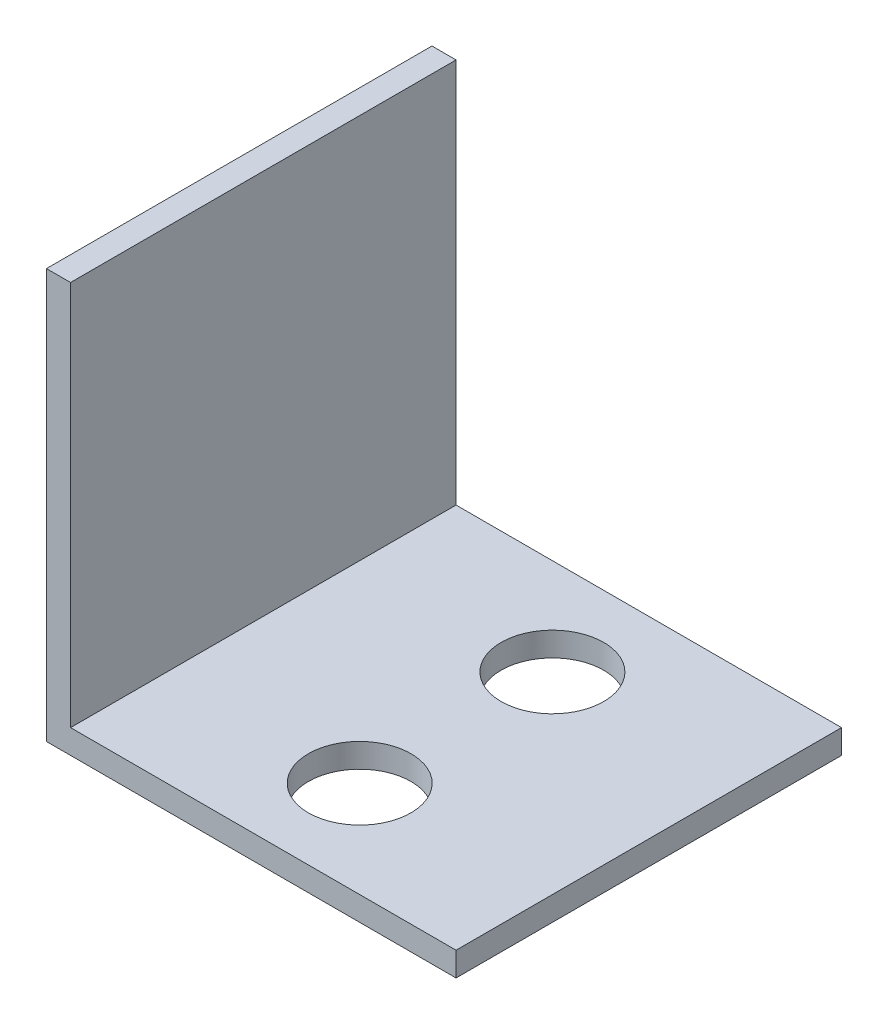
ISO-10303-21;
HEADER;
FILE_DESCRIPTION(('STEP AP214'),'2;1');
FILE_NAME('part.step','',(''),(''),'','','');
FILE_SCHEMA(('AUTOMOTIVE_DESIGN { 1 0 10303 214 1 1 1 1 }'));
ENDSEC;
DATA;
#1=APPLICATION_CONTEXT('core data for automotive mechanical design processes');
#2=APPLICATION_PROTOCOL_DEFINITION('international standard','automotive_design',2000,#1);
#3=PRODUCT_CONTEXT('',#1,'mechanical');
#4=PRODUCT('Part','Part','',(#3));
#5=PRODUCT_RELATED_PRODUCT_CATEGORY('part','',(#4));
#6=PRODUCT_DEFINITION_FORMATION('','',#4);
#7=PRODUCT_DEFINITION_CONTEXT('part definition',#1,'design');
#8=PRODUCT_DEFINITION('design','',#6,#7);
#9=PRODUCT_DEFINITION_SHAPE('','',#8);
#10=(LENGTH_UNIT() NAMED_UNIT(*) SI_UNIT(.MILLI.,.METRE.));
#11=(NAMED_UNIT(*) PLANE_ANGLE_UNIT() SI_UNIT($,.RADIAN.));
#12=(NAMED_UNIT(*) SI_UNIT($,.STERADIAN.) SOLID_ANGLE_UNIT());
#13=UNCERTAINTY_MEASURE_WITH_UNIT(LENGTH_MEASURE(1.E-05),#10,'distance_accuracy_value','');
#14=(GEOMETRIC_REPRESENTATION_CONTEXT(3) GLOBAL_UNCERTAINTY_ASSIGNED_CONTEXT((#13)) GLOBAL_UNIT_ASSIGNED_CONTEXT((#10,
#11,#12)) REPRESENTATION_CONTEXT('',''));
#15=CARTESIAN_POINT('',(0.,0.,0.));
#16=DIRECTION('',(0.,0.,1.));
#17=DIRECTION('',(1.,0.,0.));
#18=AXIS2_PLACEMENT_3D('',#15,#16,#17);
#19=CARTESIAN_POINT('',(25.4,0.,25.4));
#20=DIRECTION('',(0.,-1.,0.));
#21=DIRECTION('',(1.,0.,0.));
#22=AXIS2_PLACEMENT_3D('',#19,#20,#21);
#23=PLANE('',#22);
#24=DIRECTION('',(-1.,0.,0.));
#25=VECTOR('',#24,1.);
#26=CARTESIAN_POINT('',(25.4,0.,0.));
#27=LINE('',#26,#25);
#28=CARTESIAN_POINT('',(25.4,0.,0.));
#29=VERTEX_POINT('',#28);
#30=CARTESIAN_POINT('',(0.,0.,0.));
#31=VERTEX_POINT('',#30);
#32=EDGE_CURVE('E116',#29,#31,#27,.T.);
#33=ORIENTED_EDGE('',*,*,#32,.T.);
#34=DIRECTION('',(0.,0.,-1.));
#35=VECTOR('',#34,1.);
#36=CARTESIAN_POINT('',(0.,0.,25.4));
#37=LINE('',#36,#35);
#38=CARTESIAN_POINT('',(0.,0.,25.4));
#39=VERTEX_POINT('',#38);
#40=EDGE_CURVE('E11',#39,#31,#37,.T.);
#41=ORIENTED_EDGE('',*,*,#40,.F.);
#42=DIRECTION('',(-1.,0.,0.));
#43=VECTOR('',#42,1.);
#44=CARTESIAN_POINT('',(25.4,0.,25.4));
#45=LINE('',#44,#43);
#46=CARTESIAN_POINT('',(25.4,0.,25.4));
#47=VERTEX_POINT('',#46);
#48=EDGE_CURVE('E127',#47,#39,#45,.T.);
#49=ORIENTED_EDGE('',*,*,#48,.F.);
#50=DIRECTION('',(0.,0.,-1.));
#51=VECTOR('',#50,1.);
#52=CARTESIAN_POINT('',(25.4,0.,25.4));
#53=LINE('',#52,#51);
#54=EDGE_CURVE('E112',#47,#29,#53,.T.);
#55=ORIENTED_EDGE('',*,*,#54,.T.);
#56=EDGE_LOOP('',(#33,#41,#49,#55));
#57=FACE_BOUND('',#56,.T.);
#58=CARTESIAN_POINT('',(12.7,0.,6.35));
#59=DIRECTION('',(0.,1.,0.));
#60=DIRECTION('',(0.,0.,1.));
#61=AXIS2_PLACEMENT_3D('',#58,#59,#60);
#62=CIRCLE('',#61,3.37819999999999);
#63=CARTESIAN_POINT('',(12.7,0.,9.72819999999999));
#64=VERTEX_POINT('',#63);
#65=EDGE_CURVE('E225',#64,#64,#62,.T.);
#66=ORIENTED_EDGE('',*,*,#65,.F.);
#67=EDGE_LOOP('',(#66));
#68=FACE_BOUND('',#67,.T.);
#69=CARTESIAN_POINT('',(12.7,0.,19.05));
#70=DIRECTION('',(0.,1.,0.));
#71=DIRECTION('',(0.,0.,1.));
#72=AXIS2_PLACEMENT_3D('',#69,#70,#71);
#73=CIRCLE('',#72,3.37819999999999);
#74=CARTESIAN_POINT('',(12.7,0.,22.4282));
#75=VERTEX_POINT('',#74);
#76=EDGE_CURVE('E222',#75,#75,#73,.T.);
#77=ORIENTED_EDGE('',*,*,#76,.F.);
#78=EDGE_LOOP('',(#77));
#79=FACE_BOUND('',#78,.T.);
#80=ADVANCED_FACE('F32',(#57,#68,#79),#23,.F.);
#81=CARTESIAN_POINT('',(0.,0.,25.4));
#82=DIRECTION('',(-1.,0.,0.));
#83=DIRECTION('',(0.,0.,1.));
#84=AXIS2_PLACEMENT_3D('',#81,#82,#83);
#85=PLANE('',#84);
#86=DIRECTION('',(0.,1.,0.));
#87=VECTOR('',#86,1.);
#88=CARTESIAN_POINT('',(0.,0.,0.));
#89=LINE('',#88,#87);
#90=CARTESIAN_POINT('',(0.,25.4,0.));
#91=VERTEX_POINT('',#90);
#92=EDGE_CURVE('E119',#31,#91,#89,.T.);
#93=ORIENTED_EDGE('',*,*,#92,.T.);
#94=DIRECTION('',(0.,0.,-1.));
#95=VECTOR('',#94,1.);
#96=CARTESIAN_POINT('',(0.,25.4,25.4));
#97=LINE('',#96,#95);
#98=CARTESIAN_POINT('',(0.,25.4,25.4));
#99=VERTEX_POINT('',#98);
#100=EDGE_CURVE('E40',#99,#91,#97,.T.);
#101=ORIENTED_EDGE('',*,*,#100,.F.);
#102=DIRECTION('',(0.,1.,0.));
#103=VECTOR('',#102,1.);
#104=CARTESIAN_POINT('',(0.,0.,25.4));
#105=LINE('',#104,#103);
#106=EDGE_CURVE('E85',#39,#99,#105,.T.);
#107=ORIENTED_EDGE('',*,*,#106,.F.);
#108=ORIENTED_EDGE('',*,*,#40,.T.);
#109=EDGE_LOOP('',(#93,#101,#107,#108));
#110=FACE_BOUND('',#109,.T.);
#111=ADVANCED_FACE('F153',(#110),#85,.F.);
#112=CARTESIAN_POINT('',(0.,25.4,25.4));
#113=DIRECTION('',(0.,-1.,0.));
#114=DIRECTION('',(0.,0.,-1.));
#115=AXIS2_PLACEMENT_3D('',#112,#113,#114);
#116=PLANE('',#115);
#117=DIRECTION('',(-1.,0.,0.));
#118=VECTOR('',#117,1.);
#119=CARTESIAN_POINT('',(0.,25.4,0.));
#120=LINE('',#119,#118);
#121=CARTESIAN_POINT('',(-1.5875,25.4,0.));
#122=VERTEX_POINT('',#121);
#123=EDGE_CURVE('E122',#91,#122,#120,.T.);
#124=ORIENTED_EDGE('',*,*,#123,.T.);
#125=DIRECTION('',(0.,0.,-1.));
#126=VECTOR('',#125,1.);
#127=CARTESIAN_POINT('',(-1.5875,25.4,25.4));
#128=LINE('',#127,#126);
#129=CARTESIAN_POINT('',(-1.5875,25.4,25.4));
#130=VERTEX_POINT('',#129);
#131=EDGE_CURVE('E107',#130,#122,#128,.T.);
#132=ORIENTED_EDGE('',*,*,#131,.F.);
#133=DIRECTION('',(-1.,0.,0.));
#134=VECTOR('',#133,1.);
#135=CARTESIAN_POINT('',(0.,25.4,25.4));
#136=LINE('',#135,#134);
#137=EDGE_CURVE('E98',#99,#130,#136,.T.);
#138=ORIENTED_EDGE('',*,*,#137,.F.);
#139=ORIENTED_EDGE('',*,*,#100,.T.);
#140=EDGE_LOOP('',(#124,#132,#138,#139));
#141=FACE_BOUND('',#140,.T.);
#142=ADVANCED_FACE('F133',(#141),#116,.F.);
#143=CARTESIAN_POINT('',(-1.5875,25.4,25.4));
#144=DIRECTION('',(1.,0.,0.));
#145=DIRECTION('',(0.,1.,0.));
#146=AXIS2_PLACEMENT_3D('',#143,#144,#145);
#147=PLANE('',#146);
#148=DIRECTION('',(0.,-1.,0.));
#149=VECTOR('',#148,1.);
#150=CARTESIAN_POINT('',(-1.5875,25.4,0.));
#151=LINE('',#150,#149);
#152=CARTESIAN_POINT('',(-1.58749999999999,-1.5875,0.));
#153=VERTEX_POINT('',#152);
#154=EDGE_CURVE('E106',#122,#153,#151,.T.);
#155=ORIENTED_EDGE('',*,*,#154,.T.);
#156=DIRECTION('',(0.,0.,-1.));
#157=VECTOR('',#156,1.);
#158=CARTESIAN_POINT('',(-1.58749999999999,-1.5875,25.4));
#159=LINE('',#158,#157);
#160=CARTESIAN_POINT('',(-1.58749999999999,-1.5875,25.4));
#161=VERTEX_POINT('',#160);
#162=EDGE_CURVE('E103',#161,#153,#159,.T.);
#163=ORIENTED_EDGE('',*,*,#162,.F.);
#164=DIRECTION('',(0.,-1.,0.));
#165=VECTOR('',#164,1.);
#166=CARTESIAN_POINT('',(-1.5875,25.4,25.4));
#167=LINE('',#166,#165);
#168=EDGE_CURVE('E92',#130,#161,#167,.T.);
#169=ORIENTED_EDGE('',*,*,#168,.F.);
#170=ORIENTED_EDGE('',*,*,#131,.T.);
#171=EDGE_LOOP('',(#155,#163,#169,#170));
#172=FACE_BOUND('',#171,.T.);
#173=ADVANCED_FACE('F104',(#172),#147,.F.);
#174=CARTESIAN_POINT('',(-1.58749999999999,-1.5875,25.4));
#175=DIRECTION('',(0.,1.,0.));
#176=DIRECTION('',(-1.,0.,0.));
#177=AXIS2_PLACEMENT_3D('',#174,#175,#176);
#178=PLANE('',#177);
#179=CARTESIAN_POINT('',(12.7,-1.5875,19.05));
#180=DIRECTION('',(0.,1.,0.));
#181=DIRECTION('',(-1.,0.,0.));
#182=AXIS2_PLACEMENT_3D('',#179,#180,#181);
#183=CIRCLE('',#182,3.37819999999999);
#184=CARTESIAN_POINT('',(9.3218,-1.5875,19.05));
#185=VERTEX_POINT('',#184);
#186=EDGE_CURVE('E219',#185,#185,#183,.T.);
#187=ORIENTED_EDGE('',*,*,#186,.T.);
#188=EDGE_LOOP('',(#187));
#189=FACE_BOUND('',#188,.T.);
#190=CARTESIAN_POINT('',(12.7,-1.5875,6.35));
#191=DIRECTION('',(0.,1.,0.));
#192=DIRECTION('',(-1.,0.,0.));
#193=AXIS2_PLACEMENT_3D('',#190,#191,#192);
#194=CIRCLE('',#193,3.37819999999999);
#195=CARTESIAN_POINT('',(9.3218,-1.5875,6.35));
#196=VERTEX_POINT('',#195);
#197=EDGE_CURVE('E120',#196,#196,#194,.T.);
#198=ORIENTED_EDGE('',*,*,#197,.T.);
#199=EDGE_LOOP('',(#198));
#200=FACE_BOUND('',#199,.T.);
#201=DIRECTION('',(1.,0.,0.));
#202=VECTOR('',#201,1.);
#203=CARTESIAN_POINT('',(-1.58749999999999,-1.5875,0.));
#204=LINE('',#203,#202);
#205=CARTESIAN_POINT('',(25.4,-1.5875,0.));
#206=VERTEX_POINT('',#205);
#207=EDGE_CURVE('E71',#153,#206,#204,.T.);
#208=ORIENTED_EDGE('',*,*,#207,.T.);
#209=DIRECTION('',(0.,0.,-1.));
#210=VECTOR('',#209,1.);
#211=CARTESIAN_POINT('',(25.4,-1.5875,25.4));
#212=LINE('',#211,#210);
#213=CARTESIAN_POINT('',(25.4,-1.5875,25.4));
#214=VERTEX_POINT('',#213);
#215=EDGE_CURVE('E108',#214,#206,#212,.T.);
#216=ORIENTED_EDGE('',*,*,#215,.F.);
#217=DIRECTION('',(1.,0.,0.));
#218=VECTOR('',#217,1.);
#219=CARTESIAN_POINT('',(-1.58749999999999,-1.5875,25.4));
#220=LINE('',#219,#218);
#221=EDGE_CURVE('E96',#161,#214,#220,.T.);
#222=ORIENTED_EDGE('',*,*,#221,.F.);
#223=ORIENTED_EDGE('',*,*,#162,.T.);
#224=EDGE_LOOP('',(#208,#216,#222,#223));
#225=FACE_BOUND('',#224,.T.);
#226=ADVANCED_FACE('F110',(#189,#200,#225),#178,.F.);
#227=CARTESIAN_POINT('',(25.4,-1.5875,25.4));
#228=DIRECTION('',(-1.,0.,0.));
#229=DIRECTION('',(0.,0.,1.));
#230=AXIS2_PLACEMENT_3D('',#227,#228,#229);
#231=PLANE('',#230);
#232=DIRECTION('',(0.,1.,0.));
#233=VECTOR('',#232,1.);
#234=CARTESIAN_POINT('',(25.4,-1.5875,0.));
#235=LINE('',#234,#233);
#236=EDGE_CURVE('E77',#206,#29,#235,.T.);
#237=ORIENTED_EDGE('',*,*,#236,.T.);
#238=ORIENTED_EDGE('',*,*,#54,.F.);
#239=DIRECTION('',(0.,1.,0.));
#240=VECTOR('',#239,1.);
#241=CARTESIAN_POINT('',(25.4,-1.5875,25.4));
#242=LINE('',#241,#240);
#243=EDGE_CURVE('E48',#214,#47,#242,.T.);
#244=ORIENTED_EDGE('',*,*,#243,.F.);
#245=ORIENTED_EDGE('',*,*,#215,.T.);
#246=EDGE_LOOP('',(#237,#238,#244,#245));
#247=FACE_BOUND('',#246,.T.);
#248=ADVANCED_FACE('F141',(#247),#231,.F.);
#249=CARTESIAN_POINT('',(0.,0.,25.4));
#250=DIRECTION('',(0.,0.,-1.));
#251=DIRECTION('',(-1.,0.,0.));
#252=AXIS2_PLACEMENT_3D('',#249,#250,#251);
#253=PLANE('',#252);
#254=ORIENTED_EDGE('',*,*,#48,.T.);
#255=ORIENTED_EDGE('',*,*,#106,.T.);
#256=ORIENTED_EDGE('',*,*,#137,.T.);
#257=ORIENTED_EDGE('',*,*,#168,.T.);
#258=ORIENTED_EDGE('',*,*,#221,.T.);
#259=ORIENTED_EDGE('',*,*,#243,.T.);
#260=EDGE_LOOP('',(#254,#255,#256,#257,#258,#259));
#261=FACE_BOUND('',#260,.T.);
#262=ADVANCED_FACE('F94',(#261),#253,.F.);
#263=CARTESIAN_POINT('',(0.,0.,0.));
#264=DIRECTION('',(0.,0.,-1.));
#265=DIRECTION('',(-1.,0.,0.));
#266=AXIS2_PLACEMENT_3D('',#263,#264,#265);
#267=PLANE('',#266);
#268=ORIENTED_EDGE('',*,*,#32,.F.);
#269=ORIENTED_EDGE('',*,*,#236,.F.);
#270=ORIENTED_EDGE('',*,*,#207,.F.);
#271=ORIENTED_EDGE('',*,*,#154,.F.);
#272=ORIENTED_EDGE('',*,*,#123,.F.);
#273=ORIENTED_EDGE('',*,*,#92,.F.);
#274=EDGE_LOOP('',(#268,#269,#270,#271,#272,#273));
#275=FACE_BOUND('',#274,.T.);
#276=ADVANCED_FACE('F136',(#275),#267,.T.);
#277=CARTESIAN_POINT('',(12.7,0.,6.35));
#278=DIRECTION('',(0.,1.,0.));
#279=DIRECTION('',(0.,0.,1.));
#280=AXIS2_PLACEMENT_3D('',#277,#278,#279);
#281=CYLINDRICAL_SURFACE('',#280,3.37819999999999);
#282=ORIENTED_EDGE('',*,*,#197,.F.);
#283=EDGE_LOOP('',(#282));
#284=FACE_BOUND('',#283,.T.);
#285=ORIENTED_EDGE('',*,*,#65,.T.);
#286=EDGE_LOOP('',(#285));
#287=FACE_BOUND('',#286,.T.);
#288=ADVANCED_FACE('F180',(#284,#287),#281,.F.);
#289=CARTESIAN_POINT('',(12.7,0.,19.05));
#290=DIRECTION('',(0.,1.,0.));
#291=DIRECTION('',(0.,0.,1.));
#292=AXIS2_PLACEMENT_3D('',#289,#290,#291);
#293=CYLINDRICAL_SURFACE('',#292,3.37819999999999);
#294=ORIENTED_EDGE('',*,*,#186,.F.);
#295=EDGE_LOOP('',(#294));
#296=FACE_BOUND('',#295,.T.);
#297=ORIENTED_EDGE('',*,*,#76,.T.);
#298=EDGE_LOOP('',(#297));
#299=FACE_BOUND('',#298,.T.);
#300=ADVANCED_FACE('F185',(#296,#299),#293,.F.);
#301=CLOSED_SHELL('',(#80,#111,#142,#173,#226,#248,#262,#276,#288,#300));
#302=MANIFOLD_SOLID_BREP('B2',#301);
#303=ADVANCED_BREP_SHAPE_REPRESENTATION('',(#18,#302),#14);
#304=SHAPE_DEFINITION_REPRESENTATION(#9,#303);
ENDSEC;
END-ISO-10303-21;
